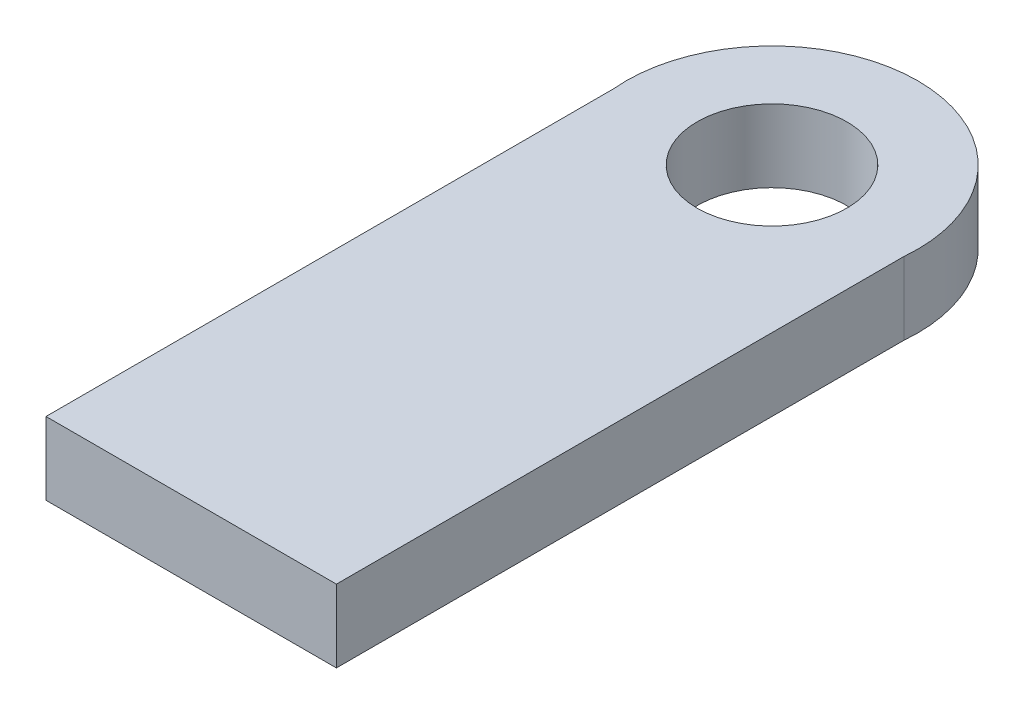
ISO-10303-21;
HEADER;
FILE_DESCRIPTION(('STEP AP214'),'2;1');
FILE_NAME('part.step','',(''),(''),'','','');
FILE_SCHEMA(('AUTOMOTIVE_DESIGN { 1 0 10303 214 1 1 1 1 }'));
ENDSEC;
DATA;
#1=APPLICATION_CONTEXT('core data for automotive mechanical design processes');
#2=APPLICATION_PROTOCOL_DEFINITION('international standard','automotive_design',2000,#1);
#3=PRODUCT_CONTEXT('',#1,'mechanical');
#4=PRODUCT('Part','Part','',(#3));
#5=PRODUCT_RELATED_PRODUCT_CATEGORY('part','',(#4));
#6=PRODUCT_DEFINITION_FORMATION('','',#4);
#7=PRODUCT_DEFINITION_CONTEXT('part definition',#1,'design');
#8=PRODUCT_DEFINITION('design','',#6,#7);
#9=PRODUCT_DEFINITION_SHAPE('','',#8);
#10=(LENGTH_UNIT() NAMED_UNIT(*) SI_UNIT(.MILLI.,.METRE.));
#11=(NAMED_UNIT(*) PLANE_ANGLE_UNIT() SI_UNIT($,.RADIAN.));
#12=(NAMED_UNIT(*) SI_UNIT($,.STERADIAN.) SOLID_ANGLE_UNIT());
#13=UNCERTAINTY_MEASURE_WITH_UNIT(LENGTH_MEASURE(1.E-05),#10,'distance_accuracy_value','');
#14=(GEOMETRIC_REPRESENTATION_CONTEXT(3) GLOBAL_UNCERTAINTY_ASSIGNED_CONTEXT((#13)) GLOBAL_UNIT_ASSIGNED_CONTEXT((#10,
#11,#12)) REPRESENTATION_CONTEXT('',''));
#15=CARTESIAN_POINT('',(0.,0.,0.));
#16=DIRECTION('',(0.,0.,1.));
#17=DIRECTION('',(1.,0.,0.));
#18=AXIS2_PLACEMENT_3D('',#15,#16,#17);
#19=CARTESIAN_POINT('',(5.92626110180849,-6.35,0.));
#20=DIRECTION('',(1.,0.,0.));
#21=DIRECTION('',(0.,0.,-1.));
#22=AXIS2_PLACEMENT_3D('',#19,#20,#21);
#23=PLANE('',#22);
#24=DIRECTION('',(0.,0.,-1.));
#25=VECTOR('',#24,1.);
#26=CARTESIAN_POINT('',(5.92626110180849,0.,0.));
#27=LINE('',#26,#25);
#28=CARTESIAN_POINT('',(5.92626110180849,0.,18.1514479853513));
#29=VERTEX_POINT('',#28);
#30=CARTESIAN_POINT('',(5.92626110180849,0.,-31.474503951343));
#31=VERTEX_POINT('',#30);
#32=EDGE_CURVE('E104',#29,#31,#27,.T.);
#33=ORIENTED_EDGE('',*,*,#32,.F.);
#34=DIRECTION('',(0.,1.,0.));
#35=VECTOR('',#34,1.);
#36=CARTESIAN_POINT('',(5.92626110180849,-6.35,18.1514479853513));
#37=LINE('',#36,#35);
#38=CARTESIAN_POINT('',(5.92626110180849,-6.35,18.1514479853513));
#39=VERTEX_POINT('',#38);
#40=EDGE_CURVE('E11',#39,#29,#37,.T.);
#41=ORIENTED_EDGE('',*,*,#40,.F.);
#42=DIRECTION('',(0.,0.,-1.));
#43=VECTOR('',#42,1.);
#44=CARTESIAN_POINT('',(5.92626110180849,-6.35,0.));
#45=LINE('',#44,#43);
#46=CARTESIAN_POINT('',(5.92626110180849,-6.35,-31.474503951343));
#47=VERTEX_POINT('',#46);
#48=EDGE_CURVE('E94',#39,#47,#45,.T.);
#49=ORIENTED_EDGE('',*,*,#48,.T.);
#50=DIRECTION('',(0.,1.,0.));
#51=VECTOR('',#50,1.);
#52=CARTESIAN_POINT('',(5.92626110180849,-6.35,-31.474503951343));
#53=LINE('',#52,#51);
#54=EDGE_CURVE('E39',#47,#31,#53,.T.);
#55=ORIENTED_EDGE('',*,*,#54,.T.);
#56=EDGE_LOOP('',(#33,#41,#49,#55));
#57=FACE_BOUND('',#56,.T.);
#58=ADVANCED_FACE('F35',(#57),#23,.T.);
#59=CARTESIAN_POINT('',(0.,-6.35,18.1514479853513));
#60=DIRECTION('',(0.,0.,1.));
#61=DIRECTION('',(1.,0.,0.));
#62=AXIS2_PLACEMENT_3D('',#59,#60,#61);
#63=PLANE('',#62);
#64=DIRECTION('',(1.,0.,0.));
#65=VECTOR('',#64,1.);
#66=CARTESIAN_POINT('',(0.,0.,18.1514479853513));
#67=LINE('',#66,#65);
#68=CARTESIAN_POINT('',(-19.4737388981915,0.,18.1514479853513));
#69=VERTEX_POINT('',#68);
#70=EDGE_CURVE('E110',#69,#29,#67,.T.);
#71=ORIENTED_EDGE('',*,*,#70,.F.);
#72=DIRECTION('',(0.,1.,0.));
#73=VECTOR('',#72,1.);
#74=CARTESIAN_POINT('',(-19.4737388981915,-6.35,18.1514479853513));
#75=LINE('',#74,#73);
#76=CARTESIAN_POINT('',(-19.4737388981915,-6.35,18.1514479853513));
#77=VERTEX_POINT('',#76);
#78=EDGE_CURVE('E45',#77,#69,#75,.T.);
#79=ORIENTED_EDGE('',*,*,#78,.F.);
#80=DIRECTION('',(1.,0.,0.));
#81=VECTOR('',#80,1.);
#82=CARTESIAN_POINT('',(0.,-6.35,18.1514479853513));
#83=LINE('',#82,#81);
#84=EDGE_CURVE('E87',#77,#39,#83,.T.);
#85=ORIENTED_EDGE('',*,*,#84,.T.);
#86=ORIENTED_EDGE('',*,*,#40,.T.);
#87=EDGE_LOOP('',(#71,#79,#85,#86));
#88=FACE_BOUND('',#87,.T.);
#89=ADVANCED_FACE('F125',(#88),#63,.T.);
#90=CARTESIAN_POINT('',(-19.4737388981915,-6.35,0.));
#91=DIRECTION('',(1.,0.,0.));
#92=DIRECTION('',(0.,0.,-1.));
#93=AXIS2_PLACEMENT_3D('',#90,#91,#92);
#94=PLANE('',#93);
#95=DIRECTION('',(0.,0.,-1.));
#96=VECTOR('',#95,1.);
#97=CARTESIAN_POINT('',(-19.4737388981915,0.,0.));
#98=LINE('',#97,#96);
#99=CARTESIAN_POINT('',(-19.4737388981915,0.,-31.474503951343));
#100=VERTEX_POINT('',#99);
#101=EDGE_CURVE('E91',#69,#100,#98,.T.);
#102=ORIENTED_EDGE('',*,*,#101,.T.);
#103=DIRECTION('',(0.,1.,0.));
#104=VECTOR('',#103,1.);
#105=CARTESIAN_POINT('',(-19.4737388981915,-6.35,-31.474503951343));
#106=LINE('',#105,#104);
#107=CARTESIAN_POINT('',(-19.4737388981915,-6.35,-31.474503951343));
#108=VERTEX_POINT('',#107);
#109=EDGE_CURVE('E89',#108,#100,#106,.T.);
#110=ORIENTED_EDGE('',*,*,#109,.F.);
#111=DIRECTION('',(0.,0.,-1.));
#112=VECTOR('',#111,1.);
#113=CARTESIAN_POINT('',(-19.4737388981915,-6.35,0.));
#114=LINE('',#113,#112);
#115=EDGE_CURVE('E83',#77,#108,#114,.T.);
#116=ORIENTED_EDGE('',*,*,#115,.F.);
#117=ORIENTED_EDGE('',*,*,#78,.T.);
#118=EDGE_LOOP('',(#102,#110,#116,#117));
#119=FACE_BOUND('',#118,.T.);
#120=ADVANCED_FACE('F90',(#119),#94,.F.);
#121=CARTESIAN_POINT('',(-6.77373889819151,-6.35,-32.6485520146487));
#122=DIRECTION('',(0.,1.,0.));
#123=DIRECTION('',(0.,0.,1.));
#124=AXIS2_PLACEMENT_3D('',#121,#122,#123);
#125=CYLINDRICAL_SURFACE('',#124,6.54812);
#126=CARTESIAN_POINT('',(-6.77373889819151,-6.35,-32.6485520146487));
#127=DIRECTION('',(0.,1.,0.));
#128=DIRECTION('',(0.,0.,1.));
#129=AXIS2_PLACEMENT_3D('',#126,#127,#128);
#130=CIRCLE('',#129,6.54812);
#131=CARTESIAN_POINT('',(-6.77373889819151,-6.35,-26.1004320146487));
#132=VERTEX_POINT('',#131);
#133=EDGE_CURVE('E96',#132,#132,#130,.T.);
#134=ORIENTED_EDGE('',*,*,#133,.F.);
#135=EDGE_LOOP('',(#134));
#136=FACE_BOUND('',#135,.T.);
#137=CARTESIAN_POINT('',(-6.77373889819151,0.,-32.6485520146487));
#138=DIRECTION('',(0.,1.,0.));
#139=DIRECTION('',(0.,0.,1.));
#140=AXIS2_PLACEMENT_3D('',#137,#138,#139);
#141=CIRCLE('',#140,6.54812);
#142=CARTESIAN_POINT('',(-6.77373889819151,0.,-26.1004320146487));
#143=VERTEX_POINT('',#142);
#144=EDGE_CURVE('E101',#143,#143,#141,.T.);
#145=ORIENTED_EDGE('',*,*,#144,.T.);
#146=EDGE_LOOP('',(#145));
#147=FACE_BOUND('',#146,.T.);
#148=ADVANCED_FACE('F37',(#136,#147),#125,.F.);
#149=CARTESIAN_POINT('',(-6.77373889819151,-6.35,-32.6485520146487));
#150=DIRECTION('',(0.,1.,0.));
#151=DIRECTION('',(0.,0.,1.));
#152=AXIS2_PLACEMENT_3D('',#149,#150,#151);
#153=CYLINDRICAL_SURFACE('',#152,12.7541518281284);
#154=CARTESIAN_POINT('',(-6.77373889819151,0.,-32.6485520146487));
#155=DIRECTION('',(0.,1.,0.));
#156=DIRECTION('',(0.,0.,1.));
#157=AXIS2_PLACEMENT_3D('',#154,#155,#156);
#158=CIRCLE('',#157,12.7541518281284);
#159=EDGE_CURVE('E107',#31,#100,#158,.T.);
#160=ORIENTED_EDGE('',*,*,#159,.F.);
#161=ORIENTED_EDGE('',*,*,#54,.F.);
#162=CARTESIAN_POINT('',(-6.77373889819151,-6.35,-32.6485520146487));
#163=DIRECTION('',(0.,1.,0.));
#164=DIRECTION('',(0.,0.,1.));
#165=AXIS2_PLACEMENT_3D('',#162,#163,#164);
#166=CIRCLE('',#165,12.7541518281284);
#167=EDGE_CURVE('E86',#47,#108,#166,.T.);
#168=ORIENTED_EDGE('',*,*,#167,.T.);
#169=ORIENTED_EDGE('',*,*,#109,.T.);
#170=EDGE_LOOP('',(#160,#161,#168,#169));
#171=FACE_BOUND('',#170,.T.);
#172=ADVANCED_FACE('F93',(#171),#153,.T.);
#173=CARTESIAN_POINT('',(0.,-6.35,0.));
#174=DIRECTION('',(0.,1.,0.));
#175=DIRECTION('',(0.,0.,1.));
#176=AXIS2_PLACEMENT_3D('',#173,#174,#175);
#177=PLANE('',#176);
#178=ORIENTED_EDGE('',*,*,#133,.T.);
#179=EDGE_LOOP('',(#178));
#180=FACE_BOUND('',#179,.T.);
#181=ORIENTED_EDGE('',*,*,#48,.F.);
#182=ORIENTED_EDGE('',*,*,#84,.F.);
#183=ORIENTED_EDGE('',*,*,#115,.T.);
#184=ORIENTED_EDGE('',*,*,#167,.F.);
#185=EDGE_LOOP('',(#181,#182,#183,#184));
#186=FACE_BOUND('',#185,.T.);
#187=ADVANCED_FACE('F85',(#180,#186),#177,.F.);
#188=CARTESIAN_POINT('',(0.,0.,0.));
#189=DIRECTION('',(0.,1.,0.));
#190=DIRECTION('',(0.,0.,1.));
#191=AXIS2_PLACEMENT_3D('',#188,#189,#190);
#192=PLANE('',#191);
#193=ORIENTED_EDGE('',*,*,#144,.F.);
#194=EDGE_LOOP('',(#193));
#195=FACE_BOUND('',#194,.T.);
#196=ORIENTED_EDGE('',*,*,#32,.T.);
#197=ORIENTED_EDGE('',*,*,#159,.T.);
#198=ORIENTED_EDGE('',*,*,#101,.F.);
#199=ORIENTED_EDGE('',*,*,#70,.T.);
#200=EDGE_LOOP('',(#196,#197,#198,#199));
#201=FACE_BOUND('',#200,.T.);
#202=ADVANCED_FACE('F122',(#195,#201),#192,.T.);
#203=CLOSED_SHELL('',(#58,#89,#120,#148,#172,#187,#202));
#204=MANIFOLD_SOLID_BREP('B2',#203);
#205=ADVANCED_BREP_SHAPE_REPRESENTATION('',(#18,#204),#14);
#206=SHAPE_DEFINITION_REPRESENTATION(#9,#205);
ENDSEC;
END-ISO-10303-21;
